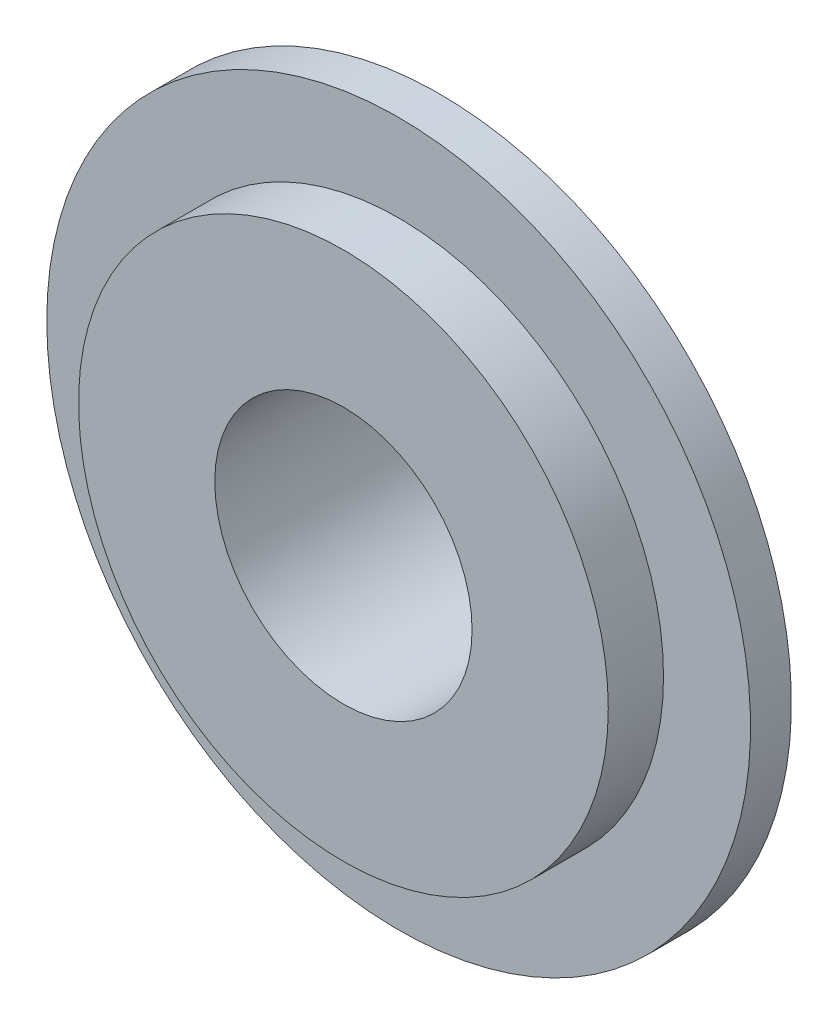
ISO-10303-21;
HEADER;
FILE_DESCRIPTION(('STEP AP214'),'2;1');
FILE_NAME('part.step','',(''),(''),'','','');
FILE_SCHEMA(('AUTOMOTIVE_DESIGN { 1 0 10303 214 1 1 1 1 }'));
ENDSEC;
DATA;
#1=APPLICATION_CONTEXT('core data for automotive mechanical design processes');
#2=APPLICATION_PROTOCOL_DEFINITION('international standard','automotive_design',2000,#1);
#3=PRODUCT_CONTEXT('',#1,'mechanical');
#4=PRODUCT('Part','Part','',(#3));
#5=PRODUCT_RELATED_PRODUCT_CATEGORY('part','',(#4));
#6=PRODUCT_DEFINITION_FORMATION('','',#4);
#7=PRODUCT_DEFINITION_CONTEXT('part definition',#1,'design');
#8=PRODUCT_DEFINITION('design','',#6,#7);
#9=PRODUCT_DEFINITION_SHAPE('','',#8);
#10=(LENGTH_UNIT() NAMED_UNIT(*) SI_UNIT(.MILLI.,.METRE.));
#11=(NAMED_UNIT(*) PLANE_ANGLE_UNIT() SI_UNIT($,.RADIAN.));
#12=(NAMED_UNIT(*) SI_UNIT($,.STERADIAN.) SOLID_ANGLE_UNIT());
#13=UNCERTAINTY_MEASURE_WITH_UNIT(LENGTH_MEASURE(1.E-05),#10,'distance_accuracy_value','');
#14=(GEOMETRIC_REPRESENTATION_CONTEXT(3) GLOBAL_UNCERTAINTY_ASSIGNED_CONTEXT((#13)) GLOBAL_UNIT_ASSIGNED_CONTEXT((#10,
#11,#12)) REPRESENTATION_CONTEXT('',''));
#15=CARTESIAN_POINT('',(0.,0.,0.));
#16=DIRECTION('',(0.,0.,1.));
#17=DIRECTION('',(1.,0.,0.));
#18=AXIS2_PLACEMENT_3D('',#15,#16,#17);
#19=CARTESIAN_POINT('',(0.,0.,-5.));
#20=DIRECTION('',(0.,0.,1.));
#21=DIRECTION('',(1.,0.,0.));
#22=AXIS2_PLACEMENT_3D('',#19,#20,#21);
#23=PLANE('',#22);
#24=CARTESIAN_POINT('',(0.,0.,-5.));
#25=DIRECTION('',(0.,0.,1.));
#26=DIRECTION('',(1.,0.,0.));
#27=AXIS2_PLACEMENT_3D('',#24,#25,#26);
#28=CIRCLE('',#27,17.5);
#29=CARTESIAN_POINT('',(17.5,0.,-5.));
#30=VERTEX_POINT('',#29);
#31=EDGE_CURVE('E46',#30,#30,#28,.T.);
#32=ORIENTED_EDGE('',*,*,#31,.F.);
#33=EDGE_LOOP('',(#32));
#34=FACE_BOUND('',#33,.T.);
#35=CARTESIAN_POINT('',(0.,0.,-5.));
#36=DIRECTION('',(0.,0.,1.));
#37=DIRECTION('',(1.,0.,0.));
#38=AXIS2_PLACEMENT_3D('',#35,#36,#37);
#39=CIRCLE('',#38,11.5869534361798);
#40=CARTESIAN_POINT('',(11.5869534361798,0.,-5.));
#41=VERTEX_POINT('',#40);
#42=EDGE_CURVE('E10',#41,#41,#39,.F.);
#43=ORIENTED_EDGE('',*,*,#42,.F.);
#44=EDGE_LOOP('',(#43));
#45=FACE_BOUND('',#44,.T.);
#46=ADVANCED_FACE('F31',(#34,#45),#23,.F.);
#47=CARTESIAN_POINT('',(0.,0.,5.));
#48=DIRECTION('',(0.,0.,-1.));
#49=DIRECTION('',(-1.,0.,0.));
#50=AXIS2_PLACEMENT_3D('',#47,#48,#49);
#51=CYLINDRICAL_SURFACE('',#50,17.5);
#52=ORIENTED_EDGE('',*,*,#31,.T.);
#53=EDGE_LOOP('',(#52));
#54=FACE_BOUND('',#53,.T.);
#55=CARTESIAN_POINT('',(0.,0.,-1.35));
#56=DIRECTION('',(0.,0.,1.));
#57=DIRECTION('',(1.,0.,0.));
#58=AXIS2_PLACEMENT_3D('',#55,#56,#57);
#59=CIRCLE('',#58,17.5);
#60=CARTESIAN_POINT('',(17.5,0.,-1.35));
#61=VERTEX_POINT('',#60);
#62=EDGE_CURVE('E38',#61,#61,#59,.T.);
#63=ORIENTED_EDGE('',*,*,#62,.F.);
#64=EDGE_LOOP('',(#63));
#65=FACE_BOUND('',#64,.T.);
#66=ADVANCED_FACE('F88',(#54,#65),#51,.T.);
#67=CARTESIAN_POINT('',(0.,0.,5.));
#68=DIRECTION('',(0.,0.,1.));
#69=DIRECTION('',(1.,0.,0.));
#70=AXIS2_PLACEMENT_3D('',#67,#68,#69);
#71=PLANE('',#70);
#72=CARTESIAN_POINT('',(0.,0.,5.));
#73=DIRECTION('',(0.,0.,1.));
#74=DIRECTION('',(1.,0.,0.));
#75=AXIS2_PLACEMENT_3D('',#72,#73,#74);
#76=CIRCLE('',#75,17.5);
#77=CARTESIAN_POINT('',(17.5,0.,5.));
#78=VERTEX_POINT('',#77);
#79=EDGE_CURVE('E42',#78,#78,#76,.T.);
#80=ORIENTED_EDGE('',*,*,#79,.T.);
#81=EDGE_LOOP('',(#80));
#82=FACE_BOUND('',#81,.T.);
#83=CARTESIAN_POINT('',(0.,0.,5.));
#84=DIRECTION('',(0.,0.,1.));
#85=DIRECTION('',(1.,0.,0.));
#86=AXIS2_PLACEMENT_3D('',#83,#84,#85);
#87=CIRCLE('',#86,8.5);
#88=CARTESIAN_POINT('',(8.5,0.,5.));
#89=VERTEX_POINT('',#88);
#90=EDGE_CURVE('E50',#89,#89,#87,.T.);
#91=ORIENTED_EDGE('',*,*,#90,.F.);
#92=EDGE_LOOP('',(#91));
#93=FACE_BOUND('',#92,.T.);
#94=ADVANCED_FACE('F93',(#82,#93),#71,.T.);
#95=CARTESIAN_POINT('',(0.,0.,1.35));
#96=DIRECTION('',(0.,0.,1.));
#97=DIRECTION('',(1.,0.,0.));
#98=AXIS2_PLACEMENT_3D('',#95,#96,#97);
#99=CIRCLE('',#98,17.5);
#100=CARTESIAN_POINT('',(17.5,0.,1.35));
#101=VERTEX_POINT('',#100);
#102=EDGE_CURVE('E58',#101,#101,#99,.T.);
#103=ORIENTED_EDGE('',*,*,#102,.T.);
#104=EDGE_LOOP('',(#103));
#105=FACE_BOUND('',#104,.T.);
#106=ORIENTED_EDGE('',*,*,#79,.F.);
#107=EDGE_LOOP('',(#106));
#108=FACE_BOUND('',#107,.T.);
#109=ADVANCED_FACE('F33',(#105,#108),#51,.T.);
#110=CARTESIAN_POINT('',(0.,0.,5.));
#111=DIRECTION('',(0.,0.,-1.));
#112=DIRECTION('',(-1.,0.,0.));
#113=AXIS2_PLACEMENT_3D('',#110,#111,#112);
#114=CYLINDRICAL_SURFACE('',#113,8.5);
#115=ORIENTED_EDGE('',*,*,#90,.T.);
#116=EDGE_LOOP('',(#115));
#117=FACE_BOUND('',#116,.T.);
#118=CARTESIAN_POINT('',(0.,0.,-7.7));
#119=DIRECTION('',(0.,0.,-1.));
#120=DIRECTION('',(-1.,0.,0.));
#121=AXIS2_PLACEMENT_3D('',#118,#119,#120);
#122=CIRCLE('',#121,8.5);
#123=CARTESIAN_POINT('',(-8.5,0.,-7.7));
#124=VERTEX_POINT('',#123);
#125=EDGE_CURVE('E66',#124,#124,#122,.T.);
#126=ORIENTED_EDGE('',*,*,#125,.T.);
#127=EDGE_LOOP('',(#126));
#128=FACE_BOUND('',#127,.T.);
#129=ADVANCED_FACE('F70',(#117,#128),#114,.F.);
#130=CARTESIAN_POINT('',(0.,0.,1.35));
#131=DIRECTION('',(0.,0.,1.));
#132=DIRECTION('',(1.,0.,0.));
#133=AXIS2_PLACEMENT_3D('',#130,#131,#132);
#134=PLANE('',#133);
#135=CARTESIAN_POINT('',(0.,0.,1.35));
#136=DIRECTION('',(0.,0.,1.));
#137=DIRECTION('',(1.,0.,0.));
#138=AXIS2_PLACEMENT_3D('',#135,#136,#137);
#139=CIRCLE('',#138,23.25);
#140=CARTESIAN_POINT('',(-23.25,0.,1.35));
#141=VERTEX_POINT('',#140);
#142=EDGE_CURVE('E54',#141,#141,#139,.T.);
#143=ORIENTED_EDGE('',*,*,#142,.T.);
#144=EDGE_LOOP('',(#143));
#145=FACE_BOUND('',#144,.T.);
#146=ORIENTED_EDGE('',*,*,#102,.F.);
#147=EDGE_LOOP('',(#146));
#148=FACE_BOUND('',#147,.T.);
#149=ADVANCED_FACE('F102',(#145,#148),#134,.T.);
#150=CARTESIAN_POINT('',(0.,0.,-1.35));
#151=DIRECTION('',(0.,0.,1.));
#152=DIRECTION('',(1.,0.,0.));
#153=AXIS2_PLACEMENT_3D('',#150,#151,#152);
#154=PLANE('',#153);
#155=CARTESIAN_POINT('',(0.,0.,-1.35));
#156=DIRECTION('',(0.,0.,1.));
#157=DIRECTION('',(1.,0.,0.));
#158=AXIS2_PLACEMENT_3D('',#155,#156,#157);
#159=CIRCLE('',#158,23.25);
#160=CARTESIAN_POINT('',(-23.25,0.,-1.35));
#161=VERTEX_POINT('',#160);
#162=EDGE_CURVE('E55',#161,#161,#159,.T.);
#163=ORIENTED_EDGE('',*,*,#162,.F.);
#164=EDGE_LOOP('',(#163));
#165=FACE_BOUND('',#164,.T.);
#166=ORIENTED_EDGE('',*,*,#62,.T.);
#167=EDGE_LOOP('',(#166));
#168=FACE_BOUND('',#167,.T.);
#169=ADVANCED_FACE('F84',(#165,#168),#154,.F.);
#170=CARTESIAN_POINT('',(0.,0.,1.35));
#171=DIRECTION('',(0.,0.,-1.));
#172=DIRECTION('',(-1.,0.,0.));
#173=AXIS2_PLACEMENT_3D('',#170,#171,#172);
#174=CYLINDRICAL_SURFACE('',#173,23.25);
#175=CARTESIAN_POINT('',(-23.25,0.,1.35));
#176=CARTESIAN_POINT('',(-23.25,0.,1.321875));
#177=CARTESIAN_POINT('',(-23.25,0.,1.29375));
#178=CARTESIAN_POINT('',(-23.25,0.,1.2375));
#179=CARTESIAN_POINT('',(-23.25,0.,1.209375));
#180=CARTESIAN_POINT('',(-23.25,0.,1.153125));
#181=CARTESIAN_POINT('',(-23.25,0.,1.125));
#182=CARTESIAN_POINT('',(-23.25,0.,1.06875));
#183=CARTESIAN_POINT('',(-23.25,0.,1.040625));
#184=CARTESIAN_POINT('',(-23.25,0.,0.984375));
#185=CARTESIAN_POINT('',(-23.25,0.,0.95625));
#186=CARTESIAN_POINT('',(-23.25,0.,0.9));
#187=CARTESIAN_POINT('',(-23.25,0.,0.871875));
#188=CARTESIAN_POINT('',(-23.25,0.,0.815625));
#189=CARTESIAN_POINT('',(-23.25,0.,0.7875));
#190=CARTESIAN_POINT('',(-23.25,0.,0.73125));
#191=CARTESIAN_POINT('',(-23.25,0.,0.703125));
#192=CARTESIAN_POINT('',(-23.25,0.,0.646875));
#193=CARTESIAN_POINT('',(-23.25,0.,0.61875));
#194=CARTESIAN_POINT('',(-23.25,0.,0.5625));
#195=CARTESIAN_POINT('',(-23.25,0.,0.534375));
#196=CARTESIAN_POINT('',(-23.25,0.,0.478125));
#197=CARTESIAN_POINT('',(-23.25,0.,0.45));
#198=CARTESIAN_POINT('',(-23.25,0.,0.39375));
#199=CARTESIAN_POINT('',(-23.25,0.,0.365625));
#200=CARTESIAN_POINT('',(-23.25,0.,0.309375));
#201=CARTESIAN_POINT('',(-23.25,0.,0.28125));
#202=CARTESIAN_POINT('',(-23.25,0.,0.225));
#203=CARTESIAN_POINT('',(-23.25,0.,0.196875));
#204=CARTESIAN_POINT('',(-23.25,0.,0.140625));
#205=CARTESIAN_POINT('',(-23.25,0.,0.1125));
#206=CARTESIAN_POINT('',(-23.25,0.,0.0562499999999998));
#207=CARTESIAN_POINT('',(-23.25,0.,0.0281249999999998));
#208=CARTESIAN_POINT('',(-23.25,0.,-0.0281250000000002));
#209=CARTESIAN_POINT('',(-23.25,0.,-0.0562500000000003));
#210=CARTESIAN_POINT('',(-23.25,0.,-0.1125));
#211=CARTESIAN_POINT('',(-23.25,0.,-0.140625));
#212=CARTESIAN_POINT('',(-23.25,0.,-0.196875));
#213=CARTESIAN_POINT('',(-23.25,0.,-0.225));
#214=CARTESIAN_POINT('',(-23.25,0.,-0.28125));
#215=CARTESIAN_POINT('',(-23.25,0.,-0.309375));
#216=CARTESIAN_POINT('',(-23.25,0.,-0.365625));
#217=CARTESIAN_POINT('',(-23.25,0.,-0.39375));
#218=CARTESIAN_POINT('',(-23.25,0.,-0.45));
#219=CARTESIAN_POINT('',(-23.25,0.,-0.478125));
#220=CARTESIAN_POINT('',(-23.25,0.,-0.534375));
#221=CARTESIAN_POINT('',(-23.25,0.,-0.5625));
#222=CARTESIAN_POINT('',(-23.25,0.,-0.61875));
#223=CARTESIAN_POINT('',(-23.25,0.,-0.646875));
#224=CARTESIAN_POINT('',(-23.25,0.,-0.703125));
#225=CARTESIAN_POINT('',(-23.25,0.,-0.73125));
#226=CARTESIAN_POINT('',(-23.25,0.,-0.7875));
#227=CARTESIAN_POINT('',(-23.25,0.,-0.815625));
#228=CARTESIAN_POINT('',(-23.25,0.,-0.871875));
#229=CARTESIAN_POINT('',(-23.25,0.,-0.9));
#230=CARTESIAN_POINT('',(-23.25,0.,-0.95625));
#231=CARTESIAN_POINT('',(-23.25,0.,-0.984375));
#232=CARTESIAN_POINT('',(-23.25,0.,-1.040625));
#233=CARTESIAN_POINT('',(-23.25,0.,-1.06875));
#234=CARTESIAN_POINT('',(-23.25,0.,-1.125));
#235=CARTESIAN_POINT('',(-23.25,0.,-1.153125));
#236=CARTESIAN_POINT('',(-23.25,0.,-1.209375));
#237=CARTESIAN_POINT('',(-23.25,0.,-1.2375));
#238=CARTESIAN_POINT('',(-23.25,0.,-1.29375));
#239=CARTESIAN_POINT('',(-23.25,0.,-1.321875));
#240=CARTESIAN_POINT('',(-23.25,0.,-1.35));
#241=B_SPLINE_CURVE_WITH_KNOTS('',3,(#175,#176,#177,#178,#179,#180,#181,#182,#183,#184,#185,
#186,#187,#188,#189,#190,#191,#192,#193,#194,#195,#196,#197,#198,#199,#200,#201,#202,#203,#204,
#205,#206,#207,#208,#209,#210,#211,#212,#213,#214,#215,#216,#217,#218,#219,#220,#221,#222,#223,
#224,#225,#226,#227,#228,#229,#230,#231,#232,#233,#234,#235,#236,#237,#238,#239,#240),
.UNSPECIFIED.,.F.,.F.,(4,2,2,2,2,2,2,2,2,2,2,2,2,2,2,2,2,2,2,2,2,2,2,2,2,2,2,2,2,2,2,2,4),(0.,
0.084375,0.16875,0.253125,0.3375,0.421875,0.50625,0.590625,0.675,0.759375,0.84375,0.928125,
1.0125,1.096875,1.18125,1.265625,1.35,1.434375,1.51875,1.603125,1.6875,1.771875,1.85625,
1.940625,2.025,2.109375,2.19375,2.278125,2.3625,2.446875,2.53125,2.615625,2.7),.UNSPECIFIED.);
#242=EDGE_CURVE('BSEAM75',#141,#161,#241,.T.);
#243=ORIENTED_EDGE('',*,*,#142,.F.);
#244=ORIENTED_EDGE('',*,*,#162,.T.);
#245=ORIENTED_EDGE('',*,*,#242,.T.);
#246=ORIENTED_EDGE('',*,*,#242,.F.);
#247=EDGE_LOOP('',(#243,#245,#244,#246));
#248=FACE_BOUND('',#247,.T.);
#249=ADVANCED_FACE('F75',(#248),#174,.T.);
#250=CARTESIAN_POINT('',(0.,0.,-7.7));
#251=DIRECTION('',(0.,0.,-1.));
#252=DIRECTION('',(-1.,0.,0.));
#253=AXIS2_PLACEMENT_3D('',#250,#251,#252);
#254=PLANE('',#253);
#255=CARTESIAN_POINT('',(0.,0.,-7.7));
#256=DIRECTION('',(0.,0.,-1.));
#257=DIRECTION('',(-1.,0.,0.));
#258=AXIS2_PLACEMENT_3D('',#255,#256,#257);
#259=CIRCLE('',#258,11.5869534361798);
#260=CARTESIAN_POINT('',(11.5869534361798,0.,-7.7));
#261=VERTEX_POINT('',#260);
#262=EDGE_CURVE('E63',#261,#261,#259,.T.);
#263=ORIENTED_EDGE('',*,*,#262,.T.);
#264=EDGE_LOOP('',(#263));
#265=FACE_BOUND('',#264,.T.);
#266=ORIENTED_EDGE('',*,*,#125,.F.);
#267=EDGE_LOOP('',(#266));
#268=FACE_BOUND('',#267,.T.);
#269=ADVANCED_FACE('F72',(#265,#268),#254,.T.);
#270=CARTESIAN_POINT('',(0.,0.,-7.7));
#271=DIRECTION('',(0.,0.,1.));
#272=DIRECTION('',(1.,0.,0.));
#273=AXIS2_PLACEMENT_3D('',#270,#271,#272);
#274=CYLINDRICAL_SURFACE('',#273,11.5869534361798);
#275=CARTESIAN_POINT('',(11.5869534361798,0.,-7.7));
#276=CARTESIAN_POINT('',(11.5869534361798,0.,-7.671875));
#277=CARTESIAN_POINT('',(11.5869534361798,0.,-7.64375));
#278=CARTESIAN_POINT('',(11.5869534361798,0.,-7.5875));
#279=CARTESIAN_POINT('',(11.5869534361798,0.,-7.559375));
#280=CARTESIAN_POINT('',(11.5869534361798,0.,-7.503125));
#281=CARTESIAN_POINT('',(11.5869534361798,0.,-7.475));
#282=CARTESIAN_POINT('',(11.5869534361798,0.,-7.41875));
#283=CARTESIAN_POINT('',(11.5869534361798,0.,-7.390625));
#284=CARTESIAN_POINT('',(11.5869534361798,0.,-7.334375));
#285=CARTESIAN_POINT('',(11.5869534361798,0.,-7.30625));
#286=CARTESIAN_POINT('',(11.5869534361798,0.,-7.25));
#287=CARTESIAN_POINT('',(11.5869534361798,0.,-7.221875));
#288=CARTESIAN_POINT('',(11.5869534361798,0.,-7.165625));
#289=CARTESIAN_POINT('',(11.5869534361798,0.,-7.1375));
#290=CARTESIAN_POINT('',(11.5869534361798,0.,-7.08125));
#291=CARTESIAN_POINT('',(11.5869534361798,0.,-7.053125));
#292=CARTESIAN_POINT('',(11.5869534361798,0.,-6.996875));
#293=CARTESIAN_POINT('',(11.5869534361798,0.,-6.96875));
#294=CARTESIAN_POINT('',(11.5869534361798,0.,-6.9125));
#295=CARTESIAN_POINT('',(11.5869534361798,0.,-6.884375));
#296=CARTESIAN_POINT('',(11.5869534361798,0.,-6.828125));
#297=CARTESIAN_POINT('',(11.5869534361798,0.,-6.8));
#298=CARTESIAN_POINT('',(11.5869534361798,0.,-6.74375));
#299=CARTESIAN_POINT('',(11.5869534361798,0.,-6.715625));
#300=CARTESIAN_POINT('',(11.5869534361798,0.,-6.659375));
#301=CARTESIAN_POINT('',(11.5869534361798,0.,-6.63125));
#302=CARTESIAN_POINT('',(11.5869534361798,0.,-6.575));
#303=CARTESIAN_POINT('',(11.5869534361798,0.,-6.546875));
#304=CARTESIAN_POINT('',(11.5869534361798,0.,-6.490625));
#305=CARTESIAN_POINT('',(11.5869534361798,0.,-6.4625));
#306=CARTESIAN_POINT('',(11.5869534361798,0.,-6.40625));
#307=CARTESIAN_POINT('',(11.5869534361798,0.,-6.378125));
#308=CARTESIAN_POINT('',(11.5869534361798,0.,-6.321875));
#309=CARTESIAN_POINT('',(11.5869534361798,0.,-6.29375));
#310=CARTESIAN_POINT('',(11.5869534361798,0.,-6.2375));
#311=CARTESIAN_POINT('',(11.5869534361798,0.,-6.209375));
#312=CARTESIAN_POINT('',(11.5869534361798,0.,-6.153125));
#313=CARTESIAN_POINT('',(11.5869534361798,0.,-6.125));
#314=CARTESIAN_POINT('',(11.5869534361798,0.,-6.06875));
#315=CARTESIAN_POINT('',(11.5869534361798,0.,-6.040625));
#316=CARTESIAN_POINT('',(11.5869534361798,0.,-5.984375));
#317=CARTESIAN_POINT('',(11.5869534361798,0.,-5.95625));
#318=CARTESIAN_POINT('',(11.5869534361798,0.,-5.9));
#319=CARTESIAN_POINT('',(11.5869534361798,0.,-5.871875));
#320=CARTESIAN_POINT('',(11.5869534361798,0.,-5.815625));
#321=CARTESIAN_POINT('',(11.5869534361798,0.,-5.7875));
#322=CARTESIAN_POINT('',(11.5869534361798,0.,-5.73125));
#323=CARTESIAN_POINT('',(11.5869534361798,0.,-5.703125));
#324=CARTESIAN_POINT('',(11.5869534361798,0.,-5.646875));
#325=CARTESIAN_POINT('',(11.5869534361798,0.,-5.61875));
#326=CARTESIAN_POINT('',(11.5869534361798,0.,-5.5625));
#327=CARTESIAN_POINT('',(11.5869534361798,0.,-5.534375));
#328=CARTESIAN_POINT('',(11.5869534361798,0.,-5.478125));
#329=CARTESIAN_POINT('',(11.5869534361798,0.,-5.45));
#330=CARTESIAN_POINT('',(11.5869534361798,0.,-5.39375));
#331=CARTESIAN_POINT('',(11.5869534361798,0.,-5.365625));
#332=CARTESIAN_POINT('',(11.5869534361798,0.,-5.309375));
#333=CARTESIAN_POINT('',(11.5869534361798,0.,-5.28125));
#334=CARTESIAN_POINT('',(11.5869534361798,0.,-5.225));
#335=CARTESIAN_POINT('',(11.5869534361798,0.,-5.196875));
#336=CARTESIAN_POINT('',(11.5869534361798,0.,-5.140625));
#337=CARTESIAN_POINT('',(11.5869534361798,0.,-5.1125));
#338=CARTESIAN_POINT('',(11.5869534361798,0.,-5.05625));
#339=CARTESIAN_POINT('',(11.5869534361798,0.,-5.028125));
#340=CARTESIAN_POINT('',(11.5869534361798,0.,-5.));
#341=B_SPLINE_CURVE_WITH_KNOTS('',3,(#275,#276,#277,#278,#279,#280,#281,#282,#283,#284,#285,
#286,#287,#288,#289,#290,#291,#292,#293,#294,#295,#296,#297,#298,#299,#300,#301,#302,#303,#304,
#305,#306,#307,#308,#309,#310,#311,#312,#313,#314,#315,#316,#317,#318,#319,#320,#321,#322,#323,
#324,#325,#326,#327,#328,#329,#330,#331,#332,#333,#334,#335,#336,#337,#338,#339,#340),
.UNSPECIFIED.,.F.,.F.,(4,2,2,2,2,2,2,2,2,2,2,2,2,2,2,2,2,2,2,2,2,2,2,2,2,2,2,2,2,2,2,2,4),(0.,
0.0843750000000003,0.168750000000001,0.253125000000001,0.3375,0.421875,0.506250000000001,
0.590625,0.675,0.759375,0.84375,0.928125,1.0125,1.096875,1.18125,1.265625,1.35,1.434375,1.51875,
1.603125,1.6875,1.771875,1.85625,1.940625,2.025,2.109375,2.19375,2.278125,2.3625,2.446875,
2.53125,2.615625,2.7),.UNSPECIFIED.);
#342=EDGE_CURVE('BSEAM74',#261,#41,#341,.T.);
#343=ORIENTED_EDGE('',*,*,#262,.F.);
#344=ORIENTED_EDGE('',*,*,#42,.T.);
#345=ORIENTED_EDGE('',*,*,#342,.T.);
#346=ORIENTED_EDGE('',*,*,#342,.F.);
#347=EDGE_LOOP('',(#343,#345,#344,#346));
#348=FACE_BOUND('',#347,.T.);
#349=ADVANCED_FACE('F74',(#348),#274,.T.);
#350=CLOSED_SHELL('',(#46,#66,#94,#109,#129,#149,#169,#249,#269,#349));
#351=MANIFOLD_SOLID_BREP('B2',#350);
#352=ADVANCED_BREP_SHAPE_REPRESENTATION('',(#18,#351),#14);
#353=SHAPE_DEFINITION_REPRESENTATION(#9,#352);
ENDSEC;
END-ISO-10303-21;
